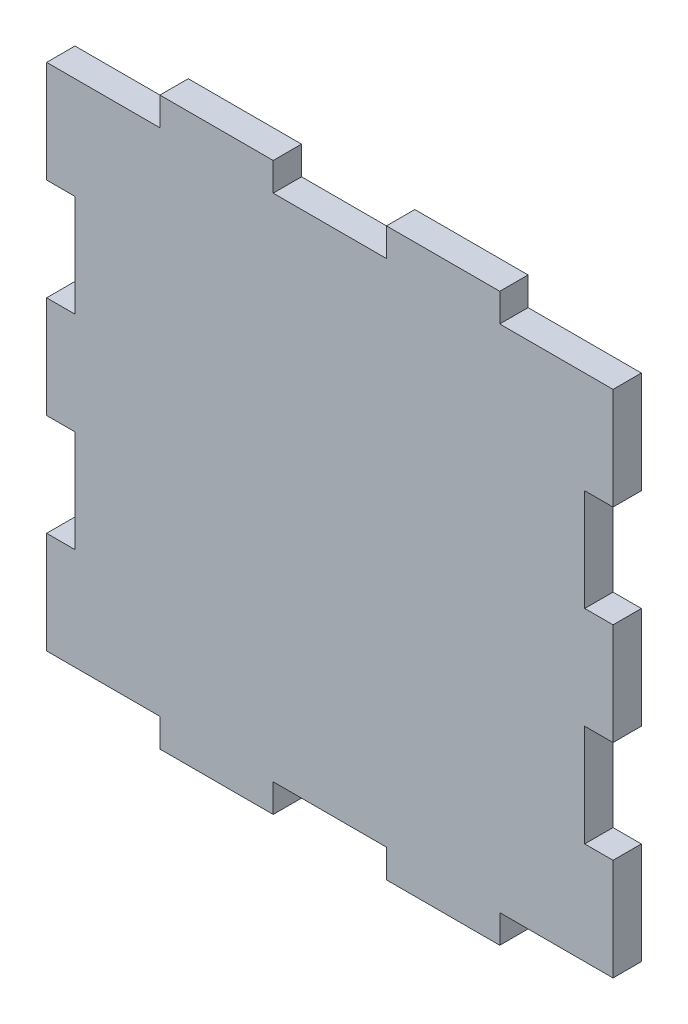
ISO-10303-21;
HEADER;
FILE_DESCRIPTION(('STEP AP214'),'2;1');
FILE_NAME('part.step','',(''),(''),'','','');
FILE_SCHEMA(('AUTOMOTIVE_DESIGN { 1 0 10303 214 1 1 1 1 }'));
ENDSEC;
DATA;
#1=APPLICATION_CONTEXT('core data for automotive mechanical design processes');
#2=APPLICATION_PROTOCOL_DEFINITION('international standard','automotive_design',2000,#1);
#3=PRODUCT_CONTEXT('',#1,'mechanical');
#4=PRODUCT('Part','Part','',(#3));
#5=PRODUCT_RELATED_PRODUCT_CATEGORY('part','',(#4));
#6=PRODUCT_DEFINITION_FORMATION('','',#4);
#7=PRODUCT_DEFINITION_CONTEXT('part definition',#1,'design');
#8=PRODUCT_DEFINITION('design','',#6,#7);
#9=PRODUCT_DEFINITION_SHAPE('','',#8);
#10=(LENGTH_UNIT() NAMED_UNIT(*) SI_UNIT(.MILLI.,.METRE.));
#11=(NAMED_UNIT(*) PLANE_ANGLE_UNIT() SI_UNIT($,.RADIAN.));
#12=(NAMED_UNIT(*) SI_UNIT($,.STERADIAN.) SOLID_ANGLE_UNIT());
#13=UNCERTAINTY_MEASURE_WITH_UNIT(LENGTH_MEASURE(1.E-05),#10,'distance_accuracy_value','');
#14=(GEOMETRIC_REPRESENTATION_CONTEXT(3) GLOBAL_UNCERTAINTY_ASSIGNED_CONTEXT((#13)) GLOBAL_UNIT_ASSIGNED_CONTEXT((#10,
#11,#12)) REPRESENTATION_CONTEXT('',''));
#15=CARTESIAN_POINT('',(0.,0.,0.));
#16=DIRECTION('',(0.,0.,1.));
#17=DIRECTION('',(1.,0.,0.));
#18=AXIS2_PLACEMENT_3D('',#15,#16,#17);
#19=CARTESIAN_POINT('',(0.,-90.,5.));
#20=DIRECTION('',(0.,1.,0.));
#21=DIRECTION('',(0.,0.,1.));
#22=AXIS2_PLACEMENT_3D('',#19,#20,#21);
#23=PLANE('',#22);
#24=DIRECTION('',(1.,0.,0.));
#25=VECTOR('',#24,1.);
#26=CARTESIAN_POINT('',(0.,-90.,5.));
#27=LINE('',#26,#25);
#28=CARTESIAN_POINT('',(-20.,-90.,5.));
#29=VERTEX_POINT('',#28);
#30=CARTESIAN_POINT('',(0.,-90.,5.));
#31=VERTEX_POINT('',#30);
#32=EDGE_CURVE('E51',#29,#31,#27,.T.);
#33=ORIENTED_EDGE('',*,*,#32,.F.);
#34=DIRECTION('',(0.,0.,1.));
#35=VECTOR('',#34,1.);
#36=CARTESIAN_POINT('',(-20.,-90.,0.));
#37=LINE('',#36,#35);
#38=CARTESIAN_POINT('',(-20.,-90.,0.));
#39=VERTEX_POINT('',#38);
#40=EDGE_CURVE('E303',#39,#29,#37,.T.);
#41=ORIENTED_EDGE('',*,*,#40,.F.);
#42=DIRECTION('',(1.,0.,0.));
#43=VECTOR('',#42,1.);
#44=CARTESIAN_POINT('',(0.,-90.,0.));
#45=LINE('',#44,#43);
#46=CARTESIAN_POINT('',(0.,-90.,0.));
#47=VERTEX_POINT('',#46);
#48=EDGE_CURVE('E520',#39,#47,#45,.T.);
#49=ORIENTED_EDGE('',*,*,#48,.T.);
#50=DIRECTION('',(0.,0.,-1.));
#51=VECTOR('',#50,1.);
#52=CARTESIAN_POINT('',(0.,-90.,5.));
#53=LINE('',#52,#51);
#54=EDGE_CURVE('E505',#31,#47,#53,.T.);
#55=ORIENTED_EDGE('',*,*,#54,.F.);
#56=EDGE_LOOP('',(#33,#41,#49,#55));
#57=FACE_BOUND('',#56,.T.);
#58=ADVANCED_FACE('F36',(#57),#23,.F.);
#59=CARTESIAN_POINT('',(-60.,-90.,0.));
#60=VERTEX_POINT('',#59);
#61=CARTESIAN_POINT('',(-40.,-90.,0.));
#62=VERTEX_POINT('',#61);
#63=EDGE_CURVE('E525',#60,#62,#45,.T.);
#64=ORIENTED_EDGE('',*,*,#63,.T.);
#65=DIRECTION('',(0.,0.,1.));
#66=VECTOR('',#65,1.);
#67=CARTESIAN_POINT('',(-40.,-90.,0.));
#68=LINE('',#67,#66);
#69=CARTESIAN_POINT('',(-40.,-90.,5.));
#70=VERTEX_POINT('',#69);
#71=EDGE_CURVE('E59',#62,#70,#68,.T.);
#72=ORIENTED_EDGE('',*,*,#71,.T.);
#73=CARTESIAN_POINT('',(-60.,-90.,5.));
#74=VERTEX_POINT('',#73);
#75=EDGE_CURVE('E506',#74,#70,#27,.T.);
#76=ORIENTED_EDGE('',*,*,#75,.F.);
#77=DIRECTION('',(0.,0.,1.));
#78=VECTOR('',#77,1.);
#79=CARTESIAN_POINT('',(-60.,-90.,0.));
#80=LINE('',#79,#78);
#81=EDGE_CURVE('E325',#60,#74,#80,.T.);
#82=ORIENTED_EDGE('',*,*,#81,.F.);
#83=EDGE_LOOP('',(#64,#72,#76,#82));
#84=FACE_BOUND('',#83,.T.);
#85=ADVANCED_FACE('F581',(#84),#23,.F.);
#86=CARTESIAN_POINT('',(0.,0.,5.));
#87=DIRECTION('',(0.,-1.,0.));
#88=DIRECTION('',(0.,0.,-1.));
#89=AXIS2_PLACEMENT_3D('',#86,#87,#88);
#90=PLANE('',#89);
#91=DIRECTION('',(0.,0.,1.));
#92=VECTOR('',#91,1.);
#93=CARTESIAN_POINT('',(-20.,0.,0.));
#94=LINE('',#93,#92);
#95=CARTESIAN_POINT('',(-20.,0.,0.));
#96=VERTEX_POINT('',#95);
#97=CARTESIAN_POINT('',(-20.,0.,5.));
#98=VERTEX_POINT('',#97);
#99=EDGE_CURVE('E346',#96,#98,#94,.T.);
#100=ORIENTED_EDGE('',*,*,#99,.T.);
#101=DIRECTION('',(-1.,0.,0.));
#102=VECTOR('',#101,1.);
#103=CARTESIAN_POINT('',(0.,0.,5.));
#104=LINE('',#103,#102);
#105=CARTESIAN_POINT('',(0.,0.,5.));
#106=VERTEX_POINT('',#105);
#107=EDGE_CURVE('E493',#106,#98,#104,.T.);
#108=ORIENTED_EDGE('',*,*,#107,.F.);
#109=DIRECTION('',(0.,0.,-1.));
#110=VECTOR('',#109,1.);
#111=CARTESIAN_POINT('',(0.,0.,5.));
#112=LINE('',#111,#110);
#113=CARTESIAN_POINT('',(0.,0.,0.));
#114=VERTEX_POINT('',#113);
#115=EDGE_CURVE('E12',#106,#114,#112,.T.);
#116=ORIENTED_EDGE('',*,*,#115,.T.);
#117=DIRECTION('',(-1.,0.,0.));
#118=VECTOR('',#117,1.);
#119=CARTESIAN_POINT('',(0.,0.,0.));
#120=LINE('',#119,#118);
#121=EDGE_CURVE('E512',#114,#96,#120,.T.);
#122=ORIENTED_EDGE('',*,*,#121,.T.);
#123=EDGE_LOOP('',(#100,#108,#116,#122));
#124=FACE_BOUND('',#123,.T.);
#125=ADVANCED_FACE('F570',(#124),#90,.F.);
#126=DIRECTION('',(0.,0.,1.));
#127=VECTOR('',#126,1.);
#128=CARTESIAN_POINT('',(-40.,0.,0.));
#129=LINE('',#128,#127);
#130=CARTESIAN_POINT('',(-40.,0.,0.));
#131=VERTEX_POINT('',#130);
#132=CARTESIAN_POINT('',(-40.,0.,5.));
#133=VERTEX_POINT('',#132);
#134=EDGE_CURVE('E350',#131,#133,#129,.T.);
#135=ORIENTED_EDGE('',*,*,#134,.F.);
#136=CARTESIAN_POINT('',(-60.,0.,0.));
#137=VERTEX_POINT('',#136);
#138=EDGE_CURVE('E516',#131,#137,#120,.T.);
#139=ORIENTED_EDGE('',*,*,#138,.T.);
#140=DIRECTION('',(0.,0.,1.));
#141=VECTOR('',#140,1.);
#142=CARTESIAN_POINT('',(-60.,0.,0.));
#143=LINE('',#142,#141);
#144=CARTESIAN_POINT('',(-60.,0.,5.));
#145=VERTEX_POINT('',#144);
#146=EDGE_CURVE('E372',#137,#145,#143,.T.);
#147=ORIENTED_EDGE('',*,*,#146,.T.);
#148=EDGE_CURVE('E497',#133,#145,#104,.T.);
#149=ORIENTED_EDGE('',*,*,#148,.F.);
#150=EDGE_LOOP('',(#135,#139,#147,#149));
#151=FACE_BOUND('',#150,.T.);
#152=ADVANCED_FACE('F560',(#151),#90,.F.);
#153=DIRECTION('',(0.,0.,1.));
#154=VECTOR('',#153,1.);
#155=CARTESIAN_POINT('',(-80.,0.,0.));
#156=LINE('',#155,#154);
#157=CARTESIAN_POINT('',(-80.,0.,0.));
#158=VERTEX_POINT('',#157);
#159=CARTESIAN_POINT('',(-80.,0.,5.));
#160=VERTEX_POINT('',#159);
#161=EDGE_CURVE('E376',#158,#160,#156,.T.);
#162=ORIENTED_EDGE('',*,*,#161,.F.);
#163=CARTESIAN_POINT('',(-100.,0.,0.));
#164=VERTEX_POINT('',#163);
#165=EDGE_CURVE('E510',#158,#164,#120,.T.);
#166=ORIENTED_EDGE('',*,*,#165,.T.);
#167=DIRECTION('',(0.,0.,-1.));
#168=VECTOR('',#167,1.);
#169=CARTESIAN_POINT('',(-100.,0.,5.));
#170=LINE('',#169,#168);
#171=CARTESIAN_POINT('',(-100.,0.,5.));
#172=VERTEX_POINT('',#171);
#173=EDGE_CURVE('E44',#172,#164,#170,.T.);
#174=ORIENTED_EDGE('',*,*,#173,.F.);
#175=EDGE_CURVE('E490',#160,#172,#104,.T.);
#176=ORIENTED_EDGE('',*,*,#175,.F.);
#177=EDGE_LOOP('',(#162,#166,#174,#176));
#178=FACE_BOUND('',#177,.T.);
#179=ADVANCED_FACE('F568',(#178),#90,.F.);
#180=CARTESIAN_POINT('',(0.,0.,5.));
#181=DIRECTION('',(-1.,0.,0.));
#182=DIRECTION('',(0.,0.,1.));
#183=AXIS2_PLACEMENT_3D('',#180,#181,#182);
#184=PLANE('',#183);
#185=DIRECTION('',(0.,0.,1.));
#186=VECTOR('',#185,1.);
#187=CARTESIAN_POINT('',(0.,-18.,0.));
#188=LINE('',#187,#186);
#189=CARTESIAN_POINT('',(0.,-18.,0.));
#190=VERTEX_POINT('',#189);
#191=CARTESIAN_POINT('',(0.,-18.,5.));
#192=VERTEX_POINT('',#191);
#193=EDGE_CURVE('E451',#190,#192,#188,.T.);
#194=ORIENTED_EDGE('',*,*,#193,.F.);
#195=DIRECTION('',(0.,1.,0.));
#196=VECTOR('',#195,1.);
#197=CARTESIAN_POINT('',(0.,0.,0.));
#198=LINE('',#197,#196);
#199=EDGE_CURVE('E453',#190,#114,#198,.T.);
#200=ORIENTED_EDGE('',*,*,#199,.T.);
#201=ORIENTED_EDGE('',*,*,#115,.F.);
#202=DIRECTION('',(0.,1.,0.));
#203=VECTOR('',#202,1.);
#204=CARTESIAN_POINT('',(0.,0.,5.));
#205=LINE('',#204,#203);
#206=EDGE_CURVE('E492',#192,#106,#205,.T.);
#207=ORIENTED_EDGE('',*,*,#206,.F.);
#208=EDGE_LOOP('',(#194,#200,#201,#207));
#209=FACE_BOUND('',#208,.T.);
#210=ADVANCED_FACE('F38',(#209),#184,.F.);
#211=DIRECTION('',(0.,0.,1.));
#212=VECTOR('',#211,1.);
#213=CARTESIAN_POINT('',(0.,-36.,0.));
#214=LINE('',#213,#212);
#215=CARTESIAN_POINT('',(0.,-36.,0.));
#216=VERTEX_POINT('',#215);
#217=CARTESIAN_POINT('',(0.,-36.,5.));
#218=VERTEX_POINT('',#217);
#219=EDGE_CURVE('E458',#216,#218,#214,.T.);
#220=ORIENTED_EDGE('',*,*,#219,.T.);
#221=CARTESIAN_POINT('',(0.,-54.,5.));
#222=VERTEX_POINT('',#221);
#223=EDGE_CURVE('E491',#222,#218,#205,.T.);
#224=ORIENTED_EDGE('',*,*,#223,.F.);
#225=DIRECTION('',(0.,0.,1.));
#226=VECTOR('',#225,1.);
#227=CARTESIAN_POINT('',(0.,-54.,0.));
#228=LINE('',#227,#226);
#229=CARTESIAN_POINT('',(0.,-54.,0.));
#230=VERTEX_POINT('',#229);
#231=EDGE_CURVE('E461',#230,#222,#228,.T.);
#232=ORIENTED_EDGE('',*,*,#231,.F.);
#233=EDGE_CURVE('E511',#230,#216,#198,.T.);
#234=ORIENTED_EDGE('',*,*,#233,.T.);
#235=EDGE_LOOP('',(#220,#224,#232,#234));
#236=FACE_BOUND('',#235,.T.);
#237=ADVANCED_FACE('F576',(#236),#184,.F.);
#238=DIRECTION('',(0.,0.,1.));
#239=VECTOR('',#238,1.);
#240=CARTESIAN_POINT('',(0.,-72.,0.));
#241=LINE('',#240,#239);
#242=CARTESIAN_POINT('',(0.,-72.,0.));
#243=VERTEX_POINT('',#242);
#244=CARTESIAN_POINT('',(0.,-72.,5.));
#245=VERTEX_POINT('',#244);
#246=EDGE_CURVE('E467',#243,#245,#241,.T.);
#247=ORIENTED_EDGE('',*,*,#246,.T.);
#248=EDGE_CURVE('E487',#31,#245,#205,.T.);
#249=ORIENTED_EDGE('',*,*,#248,.F.);
#250=ORIENTED_EDGE('',*,*,#54,.T.);
#251=EDGE_CURVE('E507',#47,#243,#198,.T.);
#252=ORIENTED_EDGE('',*,*,#251,.T.);
#253=EDGE_LOOP('',(#247,#249,#250,#252));
#254=FACE_BOUND('',#253,.T.);
#255=ADVANCED_FACE('F578',(#254),#184,.F.);
#256=CARTESIAN_POINT('',(-100.,0.,5.));
#257=DIRECTION('',(1.,0.,0.));
#258=DIRECTION('',(0.,0.,-1.));
#259=AXIS2_PLACEMENT_3D('',#256,#257,#258);
#260=PLANE('',#259);
#261=DIRECTION('',(0.,0.,1.));
#262=VECTOR('',#261,1.);
#263=CARTESIAN_POINT('',(-100.,-72.,0.));
#264=LINE('',#263,#262);
#265=CARTESIAN_POINT('',(-100.,-72.,0.));
#266=VERTEX_POINT('',#265);
#267=CARTESIAN_POINT('',(-100.,-72.,5.));
#268=VERTEX_POINT('',#267);
#269=EDGE_CURVE('E470',#266,#268,#264,.T.);
#270=ORIENTED_EDGE('',*,*,#269,.F.);
#271=DIRECTION('',(0.,-1.,0.));
#272=VECTOR('',#271,1.);
#273=CARTESIAN_POINT('',(-100.,0.,0.));
#274=LINE('',#273,#272);
#275=CARTESIAN_POINT('',(-100.,-90.,0.));
#276=VERTEX_POINT('',#275);
#277=EDGE_CURVE('E515',#266,#276,#274,.T.);
#278=ORIENTED_EDGE('',*,*,#277,.T.);
#279=DIRECTION('',(0.,0.,-1.));
#280=VECTOR('',#279,1.);
#281=CARTESIAN_POINT('',(-100.,-90.,5.));
#282=LINE('',#281,#280);
#283=CARTESIAN_POINT('',(-100.,-90.,5.));
#284=VERTEX_POINT('',#283);
#285=EDGE_CURVE('E528',#284,#276,#282,.T.);
#286=ORIENTED_EDGE('',*,*,#285,.F.);
#287=DIRECTION('',(0.,-1.,0.));
#288=VECTOR('',#287,1.);
#289=CARTESIAN_POINT('',(-100.,0.,5.));
#290=LINE('',#289,#288);
#291=EDGE_CURVE('E496',#268,#284,#290,.T.);
#292=ORIENTED_EDGE('',*,*,#291,.F.);
#293=EDGE_LOOP('',(#270,#278,#286,#292));
#294=FACE_BOUND('',#293,.T.);
#295=ADVANCED_FACE('F617',(#294),#260,.F.);
#296=DIRECTION('',(0.,0.,1.));
#297=VECTOR('',#296,1.);
#298=CARTESIAN_POINT('',(-100.,-54.,0.));
#299=LINE('',#298,#297);
#300=CARTESIAN_POINT('',(-100.,-54.,0.));
#301=VERTEX_POINT('',#300);
#302=CARTESIAN_POINT('',(-100.,-54.,5.));
#303=VERTEX_POINT('',#302);
#304=EDGE_CURVE('E476',#301,#303,#299,.T.);
#305=ORIENTED_EDGE('',*,*,#304,.T.);
#306=CARTESIAN_POINT('',(-100.,-36.,5.));
#307=VERTEX_POINT('',#306);
#308=EDGE_CURVE('E501',#307,#303,#290,.T.);
#309=ORIENTED_EDGE('',*,*,#308,.F.);
#310=DIRECTION('',(0.,0.,1.));
#311=VECTOR('',#310,1.);
#312=CARTESIAN_POINT('',(-100.,-36.,0.));
#313=LINE('',#312,#311);
#314=CARTESIAN_POINT('',(-100.,-36.,0.));
#315=VERTEX_POINT('',#314);
#316=EDGE_CURVE('E479',#315,#307,#313,.T.);
#317=ORIENTED_EDGE('',*,*,#316,.F.);
#318=EDGE_CURVE('E521',#315,#301,#274,.T.);
#319=ORIENTED_EDGE('',*,*,#318,.T.);
#320=EDGE_LOOP('',(#305,#309,#317,#319));
#321=FACE_BOUND('',#320,.T.);
#322=ADVANCED_FACE('F622',(#321),#260,.F.);
#323=DIRECTION('',(0.,0.,1.));
#324=VECTOR('',#323,1.);
#325=CARTESIAN_POINT('',(-100.,-18.,0.));
#326=LINE('',#325,#324);
#327=CARTESIAN_POINT('',(-100.,-18.,0.));
#328=VERTEX_POINT('',#327);
#329=CARTESIAN_POINT('',(-100.,-18.,5.));
#330=VERTEX_POINT('',#329);
#331=EDGE_CURVE('E416',#328,#330,#326,.T.);
#332=ORIENTED_EDGE('',*,*,#331,.T.);
#333=EDGE_CURVE('E498',#172,#330,#290,.T.);
#334=ORIENTED_EDGE('',*,*,#333,.F.);
#335=ORIENTED_EDGE('',*,*,#173,.T.);
#336=EDGE_CURVE('E517',#164,#328,#274,.T.);
#337=ORIENTED_EDGE('',*,*,#336,.T.);
#338=EDGE_LOOP('',(#332,#334,#335,#337));
#339=FACE_BOUND('',#338,.T.);
#340=ADVANCED_FACE('F535',(#339),#260,.F.);
#341=CARTESIAN_POINT('',(0.,0.,5.));
#342=DIRECTION('',(0.,0.,-1.));
#343=DIRECTION('',(-1.,0.,0.));
#344=AXIS2_PLACEMENT_3D('',#341,#342,#343);
#345=PLANE('',#344);
#346=DIRECTION('',(1.,0.,0.));
#347=VECTOR('',#346,1.);
#348=CARTESIAN_POINT('',(0.,-18.,5.));
#349=LINE('',#348,#347);
#350=CARTESIAN_POINT('',(-5.,-18.,5.));
#351=VERTEX_POINT('',#350);
#352=EDGE_CURVE('E387',#351,#192,#349,.T.);
#353=ORIENTED_EDGE('',*,*,#352,.T.);
#354=ORIENTED_EDGE('',*,*,#206,.T.);
#355=ORIENTED_EDGE('',*,*,#107,.T.);
#356=DIRECTION('',(0.,-1.,0.));
#357=VECTOR('',#356,1.);
#358=CARTESIAN_POINT('',(-20.,0.,5.));
#359=LINE('',#358,#357);
#360=CARTESIAN_POINT('',(-20.,5.00000000000001,5.));
#361=VERTEX_POINT('',#360);
#362=EDGE_CURVE('E327',#361,#98,#359,.T.);
#363=ORIENTED_EDGE('',*,*,#362,.F.);
#364=DIRECTION('',(1.,0.,0.));
#365=VECTOR('',#364,1.);
#366=CARTESIAN_POINT('',(0.,5.00000000000001,5.));
#367=LINE('',#366,#365);
#368=CARTESIAN_POINT('',(-40.,5.00000000000001,5.));
#369=VERTEX_POINT('',#368);
#370=EDGE_CURVE('E343',#369,#361,#367,.T.);
#371=ORIENTED_EDGE('',*,*,#370,.F.);
#372=DIRECTION('',(0.,1.,0.));
#373=VECTOR('',#372,1.);
#374=CARTESIAN_POINT('',(-40.,0.,5.));
#375=LINE('',#374,#373);
#376=EDGE_CURVE('E337',#133,#369,#375,.T.);
#377=ORIENTED_EDGE('',*,*,#376,.F.);
#378=ORIENTED_EDGE('',*,*,#148,.T.);
#379=DIRECTION('',(0.,-1.,0.));
#380=VECTOR('',#379,1.);
#381=CARTESIAN_POINT('',(-60.,0.,5.));
#382=LINE('',#381,#380);
#383=CARTESIAN_POINT('',(-60.,5.00000000000001,5.));
#384=VERTEX_POINT('',#383);
#385=EDGE_CURVE('E349',#384,#145,#382,.T.);
#386=ORIENTED_EDGE('',*,*,#385,.F.);
#387=DIRECTION('',(1.,0.,0.));
#388=VECTOR('',#387,1.);
#389=CARTESIAN_POINT('',(0.,5.00000000000001,5.));
#390=LINE('',#389,#388);
#391=CARTESIAN_POINT('',(-80.,5.,5.));
#392=VERTEX_POINT('',#391);
#393=EDGE_CURVE('E369',#392,#384,#390,.T.);
#394=ORIENTED_EDGE('',*,*,#393,.F.);
#395=DIRECTION('',(0.,1.,0.));
#396=VECTOR('',#395,1.);
#397=CARTESIAN_POINT('',(-80.,0.,5.));
#398=LINE('',#397,#396);
#399=EDGE_CURVE('E362',#160,#392,#398,.T.);
#400=ORIENTED_EDGE('',*,*,#399,.F.);
#401=ORIENTED_EDGE('',*,*,#175,.T.);
#402=ORIENTED_EDGE('',*,*,#333,.T.);
#403=DIRECTION('',(1.,0.,0.));
#404=VECTOR('',#403,1.);
#405=CARTESIAN_POINT('',(-100.,-18.,5.));
#406=LINE('',#405,#404);
#407=CARTESIAN_POINT('',(-95.,-18.,5.));
#408=VERTEX_POINT('',#407);
#409=EDGE_CURVE('E375',#330,#408,#406,.T.);
#410=ORIENTED_EDGE('',*,*,#409,.T.);
#411=DIRECTION('',(0.,-1.,0.));
#412=VECTOR('',#411,1.);
#413=CARTESIAN_POINT('',(-95.,-18.,5.));
#414=LINE('',#413,#412);
#415=CARTESIAN_POINT('',(-95.,-36.,5.));
#416=VERTEX_POINT('',#415);
#417=EDGE_CURVE('E419',#408,#416,#414,.T.);
#418=ORIENTED_EDGE('',*,*,#417,.T.);
#419=DIRECTION('',(-1.,0.,0.));
#420=VECTOR('',#419,1.);
#421=CARTESIAN_POINT('',(-95.,-36.,5.));
#422=LINE('',#421,#420);
#423=EDGE_CURVE('E422',#416,#307,#422,.T.);
#424=ORIENTED_EDGE('',*,*,#423,.T.);
#425=ORIENTED_EDGE('',*,*,#308,.T.);
#426=DIRECTION('',(1.,0.,0.));
#427=VECTOR('',#426,1.);
#428=CARTESIAN_POINT('',(-100.,-54.,5.));
#429=LINE('',#428,#427);
#430=CARTESIAN_POINT('',(-95.,-54.,5.));
#431=VERTEX_POINT('',#430);
#432=EDGE_CURVE('E425',#303,#431,#429,.T.);
#433=ORIENTED_EDGE('',*,*,#432,.T.);
#434=DIRECTION('',(0.,-1.,0.));
#435=VECTOR('',#434,1.);
#436=CARTESIAN_POINT('',(-95.,-54.,5.));
#437=LINE('',#436,#435);
#438=CARTESIAN_POINT('',(-95.,-72.,5.));
#439=VERTEX_POINT('',#438);
#440=EDGE_CURVE('E428',#431,#439,#437,.T.);
#441=ORIENTED_EDGE('',*,*,#440,.T.);
#442=DIRECTION('',(-1.,0.,0.));
#443=VECTOR('',#442,1.);
#444=CARTESIAN_POINT('',(-95.,-72.,5.));
#445=LINE('',#444,#443);
#446=EDGE_CURVE('E431',#439,#268,#445,.T.);
#447=ORIENTED_EDGE('',*,*,#446,.T.);
#448=ORIENTED_EDGE('',*,*,#291,.T.);
#449=CARTESIAN_POINT('',(-80.,-90.,5.));
#450=VERTEX_POINT('',#449);
#451=EDGE_CURVE('E502',#284,#450,#27,.T.);
#452=ORIENTED_EDGE('',*,*,#451,.T.);
#453=DIRECTION('',(0.,-1.,0.));
#454=VECTOR('',#453,1.);
#455=CARTESIAN_POINT('',(-80.,0.,5.));
#456=LINE('',#455,#454);
#457=CARTESIAN_POINT('',(-80.,-95.,5.));
#458=VERTEX_POINT('',#457);
#459=EDGE_CURVE('E305',#450,#458,#456,.T.);
#460=ORIENTED_EDGE('',*,*,#459,.T.);
#461=DIRECTION('',(1.,0.,0.));
#462=VECTOR('',#461,1.);
#463=CARTESIAN_POINT('',(0.,-95.,5.));
#464=LINE('',#463,#462);
#465=CARTESIAN_POINT('',(-60.,-95.,5.));
#466=VERTEX_POINT('',#465);
#467=EDGE_CURVE('E320',#458,#466,#464,.T.);
#468=ORIENTED_EDGE('',*,*,#467,.T.);
#469=DIRECTION('',(0.,1.,0.));
#470=VECTOR('',#469,1.);
#471=CARTESIAN_POINT('',(-60.,0.,5.));
#472=LINE('',#471,#470);
#473=EDGE_CURVE('E312',#466,#74,#472,.T.);
#474=ORIENTED_EDGE('',*,*,#473,.T.);
#475=ORIENTED_EDGE('',*,*,#75,.T.);
#476=DIRECTION('',(0.,-1.,0.));
#477=VECTOR('',#476,1.);
#478=CARTESIAN_POINT('',(-40.,0.,5.));
#479=LINE('',#478,#477);
#480=CARTESIAN_POINT('',(-40.,-95.,5.));
#481=VERTEX_POINT('',#480);
#482=EDGE_CURVE('E300',#70,#481,#479,.T.);
#483=ORIENTED_EDGE('',*,*,#482,.T.);
#484=DIRECTION('',(1.,0.,0.));
#485=VECTOR('',#484,1.);
#486=CARTESIAN_POINT('',(0.,-95.,5.));
#487=LINE('',#486,#485);
#488=CARTESIAN_POINT('',(-20.,-95.,5.));
#489=VERTEX_POINT('',#488);
#490=EDGE_CURVE('E277',#481,#489,#487,.T.);
#491=ORIENTED_EDGE('',*,*,#490,.T.);
#492=DIRECTION('',(0.,1.,0.));
#493=VECTOR('',#492,1.);
#494=CARTESIAN_POINT('',(-20.,0.,5.));
#495=LINE('',#494,#493);
#496=EDGE_CURVE('E294',#489,#29,#495,.T.);
#497=ORIENTED_EDGE('',*,*,#496,.T.);
#498=ORIENTED_EDGE('',*,*,#32,.T.);
#499=ORIENTED_EDGE('',*,*,#248,.T.);
#500=DIRECTION('',(-1.,0.,0.));
#501=VECTOR('',#500,1.);
#502=CARTESIAN_POINT('',(-5.,-72.,5.));
#503=LINE('',#502,#501);
#504=CARTESIAN_POINT('',(-5.,-72.,5.));
#505=VERTEX_POINT('',#504);
#506=EDGE_CURVE('E434',#245,#505,#503,.T.);
#507=ORIENTED_EDGE('',*,*,#506,.T.);
#508=DIRECTION('',(0.,1.,0.));
#509=VECTOR('',#508,1.);
#510=CARTESIAN_POINT('',(-5.,-54.,5.));
#511=LINE('',#510,#509);
#512=CARTESIAN_POINT('',(-5.,-54.,5.));
#513=VERTEX_POINT('',#512);
#514=EDGE_CURVE('E437',#505,#513,#511,.T.);
#515=ORIENTED_EDGE('',*,*,#514,.T.);
#516=DIRECTION('',(1.,0.,0.));
#517=VECTOR('',#516,1.);
#518=CARTESIAN_POINT('',(0.,-54.,5.));
#519=LINE('',#518,#517);
#520=EDGE_CURVE('E440',#513,#222,#519,.T.);
#521=ORIENTED_EDGE('',*,*,#520,.T.);
#522=ORIENTED_EDGE('',*,*,#223,.T.);
#523=DIRECTION('',(-1.,0.,0.));
#524=VECTOR('',#523,1.);
#525=CARTESIAN_POINT('',(-5.,-36.,5.));
#526=LINE('',#525,#524);
#527=CARTESIAN_POINT('',(-5.,-36.,5.));
#528=VERTEX_POINT('',#527);
#529=EDGE_CURVE('E443',#218,#528,#526,.T.);
#530=ORIENTED_EDGE('',*,*,#529,.T.);
#531=DIRECTION('',(0.,1.,0.));
#532=VECTOR('',#531,1.);
#533=CARTESIAN_POINT('',(-5.,-18.,5.));
#534=LINE('',#533,#532);
#535=EDGE_CURVE('E446',#528,#351,#534,.T.);
#536=ORIENTED_EDGE('',*,*,#535,.T.);
#537=EDGE_LOOP('',(#353,#354,#355,#363,#371,#377,#378,#386,#394,#400,#401,#402,#410,#418,#424,
#425,#433,#441,#447,#448,#452,#460,#468,#474,#475,#483,#491,#497,#498,#499,#507,#515,#521,#522,
#530,#536));
#538=FACE_BOUND('',#537,.T.);
#539=ADVANCED_FACE('F546',(#538),#345,.F.);
#540=CARTESIAN_POINT('',(0.,0.,0.));
#541=DIRECTION('',(0.,0.,-1.));
#542=DIRECTION('',(-1.,0.,0.));
#543=AXIS2_PLACEMENT_3D('',#540,#541,#542);
#544=PLANE('',#543);
#545=ORIENTED_EDGE('',*,*,#199,.F.);
#546=DIRECTION('',(1.,0.,0.));
#547=VECTOR('',#546,1.);
#548=CARTESIAN_POINT('',(0.,-18.,0.));
#549=LINE('',#548,#547);
#550=CARTESIAN_POINT('',(-5.,-18.,0.));
#551=VERTEX_POINT('',#550);
#552=EDGE_CURVE('E414',#551,#190,#549,.T.);
#553=ORIENTED_EDGE('',*,*,#552,.F.);
#554=DIRECTION('',(0.,1.,0.));
#555=VECTOR('',#554,1.);
#556=CARTESIAN_POINT('',(-5.,-18.,0.));
#557=LINE('',#556,#555);
#558=CARTESIAN_POINT('',(-5.,-36.,0.));
#559=VERTEX_POINT('',#558);
#560=EDGE_CURVE('E411',#559,#551,#557,.T.);
#561=ORIENTED_EDGE('',*,*,#560,.F.);
#562=DIRECTION('',(-1.,0.,0.));
#563=VECTOR('',#562,1.);
#564=CARTESIAN_POINT('',(-5.,-36.,0.));
#565=LINE('',#564,#563);
#566=EDGE_CURVE('E408',#216,#559,#565,.T.);
#567=ORIENTED_EDGE('',*,*,#566,.F.);
#568=ORIENTED_EDGE('',*,*,#233,.F.);
#569=DIRECTION('',(1.,0.,0.));
#570=VECTOR('',#569,1.);
#571=CARTESIAN_POINT('',(0.,-54.,0.));
#572=LINE('',#571,#570);
#573=CARTESIAN_POINT('',(-5.,-54.,0.));
#574=VERTEX_POINT('',#573);
#575=EDGE_CURVE('E406',#574,#230,#572,.T.);
#576=ORIENTED_EDGE('',*,*,#575,.F.);
#577=DIRECTION('',(0.,1.,0.));
#578=VECTOR('',#577,1.);
#579=CARTESIAN_POINT('',(-5.,-54.,0.));
#580=LINE('',#579,#578);
#581=CARTESIAN_POINT('',(-5.,-72.,0.));
#582=VERTEX_POINT('',#581);
#583=EDGE_CURVE('E403',#582,#574,#580,.T.);
#584=ORIENTED_EDGE('',*,*,#583,.F.);
#585=DIRECTION('',(-1.,0.,0.));
#586=VECTOR('',#585,1.);
#587=CARTESIAN_POINT('',(-5.,-72.,0.));
#588=LINE('',#587,#586);
#589=EDGE_CURVE('E400',#243,#582,#588,.T.);
#590=ORIENTED_EDGE('',*,*,#589,.F.);
#591=ORIENTED_EDGE('',*,*,#251,.F.);
#592=ORIENTED_EDGE('',*,*,#48,.F.);
#593=DIRECTION('',(0.,1.,0.));
#594=VECTOR('',#593,1.);
#595=CARTESIAN_POINT('',(-20.,0.,0.));
#596=LINE('',#595,#594);
#597=CARTESIAN_POINT('',(-20.,-95.,0.));
#598=VERTEX_POINT('',#597);
#599=EDGE_CURVE('E291',#598,#39,#596,.T.);
#600=ORIENTED_EDGE('',*,*,#599,.F.);
#601=DIRECTION('',(1.,0.,0.));
#602=VECTOR('',#601,1.);
#603=CARTESIAN_POINT('',(0.,-95.,0.));
#604=LINE('',#603,#602);
#605=CARTESIAN_POINT('',(-40.,-95.,0.));
#606=VERTEX_POINT('',#605);
#607=EDGE_CURVE('E274',#606,#598,#604,.T.);
#608=ORIENTED_EDGE('',*,*,#607,.F.);
#609=DIRECTION('',(0.,-1.,0.));
#610=VECTOR('',#609,1.);
#611=CARTESIAN_POINT('',(-40.,0.,0.));
#612=LINE('',#611,#610);
#613=EDGE_CURVE('E289',#62,#606,#612,.T.);
#614=ORIENTED_EDGE('',*,*,#613,.F.);
#615=ORIENTED_EDGE('',*,*,#63,.F.);
#616=DIRECTION('',(0.,1.,0.));
#617=VECTOR('',#616,1.);
#618=CARTESIAN_POINT('',(-60.,0.,0.));
#619=LINE('',#618,#617);
#620=CARTESIAN_POINT('',(-60.,-95.,0.));
#621=VERTEX_POINT('',#620);
#622=EDGE_CURVE('E315',#621,#60,#619,.T.);
#623=ORIENTED_EDGE('',*,*,#622,.F.);
#624=DIRECTION('',(1.,0.,0.));
#625=VECTOR('',#624,1.);
#626=CARTESIAN_POINT('',(0.,-95.,0.));
#627=LINE('',#626,#625);
#628=CARTESIAN_POINT('',(-80.,-95.,0.));
#629=VERTEX_POINT('',#628);
#630=EDGE_CURVE('E311',#629,#621,#627,.T.);
#631=ORIENTED_EDGE('',*,*,#630,.F.);
#632=DIRECTION('',(0.,-1.,0.));
#633=VECTOR('',#632,1.);
#634=CARTESIAN_POINT('',(-80.,0.,0.));
#635=LINE('',#634,#633);
#636=CARTESIAN_POINT('',(-80.,-90.,0.));
#637=VERTEX_POINT('',#636);
#638=EDGE_CURVE('E308',#637,#629,#635,.T.);
#639=ORIENTED_EDGE('',*,*,#638,.F.);
#640=EDGE_CURVE('E522',#276,#637,#45,.T.);
#641=ORIENTED_EDGE('',*,*,#640,.F.);
#642=ORIENTED_EDGE('',*,*,#277,.F.);
#643=DIRECTION('',(-1.,0.,0.));
#644=VECTOR('',#643,1.);
#645=CARTESIAN_POINT('',(-95.,-72.,0.));
#646=LINE('',#645,#644);
#647=CARTESIAN_POINT('',(-95.,-72.,0.));
#648=VERTEX_POINT('',#647);
#649=EDGE_CURVE('E398',#648,#266,#646,.T.);
#650=ORIENTED_EDGE('',*,*,#649,.F.);
#651=DIRECTION('',(0.,-1.,0.));
#652=VECTOR('',#651,1.);
#653=CARTESIAN_POINT('',(-95.,-54.,0.));
#654=LINE('',#653,#652);
#655=CARTESIAN_POINT('',(-95.,-54.,0.));
#656=VERTEX_POINT('',#655);
#657=EDGE_CURVE('E395',#656,#648,#654,.T.);
#658=ORIENTED_EDGE('',*,*,#657,.F.);
#659=DIRECTION('',(1.,0.,0.));
#660=VECTOR('',#659,1.);
#661=CARTESIAN_POINT('',(-100.,-54.,0.));
#662=LINE('',#661,#660);
#663=EDGE_CURVE('E392',#301,#656,#662,.T.);
#664=ORIENTED_EDGE('',*,*,#663,.F.);
#665=ORIENTED_EDGE('',*,*,#318,.F.);
#666=DIRECTION('',(-1.,0.,0.));
#667=VECTOR('',#666,1.);
#668=CARTESIAN_POINT('',(-95.,-36.,0.));
#669=LINE('',#668,#667);
#670=CARTESIAN_POINT('',(-95.,-36.,0.));
#671=VERTEX_POINT('',#670);
#672=EDGE_CURVE('E390',#671,#315,#669,.T.);
#673=ORIENTED_EDGE('',*,*,#672,.F.);
#674=DIRECTION('',(0.,-1.,0.));
#675=VECTOR('',#674,1.);
#676=CARTESIAN_POINT('',(-95.,-18.,0.));
#677=LINE('',#676,#675);
#678=CARTESIAN_POINT('',(-95.,-18.,0.));
#679=VERTEX_POINT('',#678);
#680=EDGE_CURVE('E386',#679,#671,#677,.T.);
#681=ORIENTED_EDGE('',*,*,#680,.F.);
#682=DIRECTION('',(1.,0.,0.));
#683=VECTOR('',#682,1.);
#684=CARTESIAN_POINT('',(-100.,-18.,0.));
#685=LINE('',#684,#683);
#686=EDGE_CURVE('E383',#328,#679,#685,.T.);
#687=ORIENTED_EDGE('',*,*,#686,.F.);
#688=ORIENTED_EDGE('',*,*,#336,.F.);
#689=ORIENTED_EDGE('',*,*,#165,.F.);
#690=DIRECTION('',(0.,1.,0.));
#691=VECTOR('',#690,1.);
#692=CARTESIAN_POINT('',(-80.,0.,0.));
#693=LINE('',#692,#691);
#694=CARTESIAN_POINT('',(-80.,5.,0.));
#695=VERTEX_POINT('',#694);
#696=EDGE_CURVE('E364',#158,#695,#693,.T.);
#697=ORIENTED_EDGE('',*,*,#696,.T.);
#698=DIRECTION('',(1.,0.,0.));
#699=VECTOR('',#698,1.);
#700=CARTESIAN_POINT('',(0.,5.00000000000001,0.));
#701=LINE('',#700,#699);
#702=CARTESIAN_POINT('',(-60.,5.00000000000001,0.));
#703=VERTEX_POINT('',#702);
#704=EDGE_CURVE('E361',#695,#703,#701,.T.);
#705=ORIENTED_EDGE('',*,*,#704,.T.);
#706=DIRECTION('',(0.,-1.,0.));
#707=VECTOR('',#706,1.);
#708=CARTESIAN_POINT('',(-60.,0.,0.));
#709=LINE('',#708,#707);
#710=EDGE_CURVE('E358',#703,#137,#709,.T.);
#711=ORIENTED_EDGE('',*,*,#710,.T.);
#712=ORIENTED_EDGE('',*,*,#138,.F.);
#713=DIRECTION('',(0.,1.,0.));
#714=VECTOR('',#713,1.);
#715=CARTESIAN_POINT('',(-40.,0.,0.));
#716=LINE('',#715,#714);
#717=CARTESIAN_POINT('',(-40.,5.00000000000001,0.));
#718=VERTEX_POINT('',#717);
#719=EDGE_CURVE('E339',#131,#718,#716,.T.);
#720=ORIENTED_EDGE('',*,*,#719,.T.);
#721=DIRECTION('',(1.,0.,0.));
#722=VECTOR('',#721,1.);
#723=CARTESIAN_POINT('',(0.,5.00000000000001,0.));
#724=LINE('',#723,#722);
#725=CARTESIAN_POINT('',(-20.,5.00000000000001,0.));
#726=VERTEX_POINT('',#725);
#727=EDGE_CURVE('E336',#718,#726,#724,.T.);
#728=ORIENTED_EDGE('',*,*,#727,.T.);
#729=DIRECTION('',(0.,-1.,0.));
#730=VECTOR('',#729,1.);
#731=CARTESIAN_POINT('',(-20.,0.,0.));
#732=LINE('',#731,#730);
#733=EDGE_CURVE('E334',#726,#96,#732,.T.);
#734=ORIENTED_EDGE('',*,*,#733,.T.);
#735=ORIENTED_EDGE('',*,*,#121,.F.);
#736=EDGE_LOOP('',(#545,#553,#561,#567,#568,#576,#584,#590,#591,#592,#600,#608,#614,#615,#623,
#631,#639,#641,#642,#650,#658,#664,#665,#673,#681,#687,#688,#689,#697,#705,#711,#712,#720,#728,
#734,#735));
#737=FACE_BOUND('',#736,.T.);
#738=ADVANCED_FACE('F287',(#737),#544,.T.);
#739=ORIENTED_EDGE('',*,*,#640,.T.);
#740=DIRECTION('',(0.,0.,1.));
#741=VECTOR('',#740,1.);
#742=CARTESIAN_POINT('',(-80.,-90.,0.));
#743=LINE('',#742,#741);
#744=EDGE_CURVE('E317',#637,#450,#743,.T.);
#745=ORIENTED_EDGE('',*,*,#744,.T.);
#746=ORIENTED_EDGE('',*,*,#451,.F.);
#747=ORIENTED_EDGE('',*,*,#285,.T.);
#748=EDGE_LOOP('',(#739,#745,#746,#747));
#749=FACE_BOUND('',#748,.T.);
#750=ADVANCED_FACE('F585',(#749),#23,.F.);
#751=CARTESIAN_POINT('',(-100.,-18.,0.));
#752=DIRECTION('',(0.,-1.,0.));
#753=DIRECTION('',(0.,0.,-1.));
#754=AXIS2_PLACEMENT_3D('',#751,#752,#753);
#755=PLANE('',#754);
#756=ORIENTED_EDGE('',*,*,#409,.F.);
#757=ORIENTED_EDGE('',*,*,#331,.F.);
#758=ORIENTED_EDGE('',*,*,#686,.T.);
#759=DIRECTION('',(0.,0.,1.));
#760=VECTOR('',#759,1.);
#761=CARTESIAN_POINT('',(-95.,-18.,0.));
#762=LINE('',#761,#760);
#763=EDGE_CURVE('E483',#679,#408,#762,.T.);
#764=ORIENTED_EDGE('',*,*,#763,.T.);
#765=EDGE_LOOP('',(#756,#757,#758,#764));
#766=FACE_BOUND('',#765,.T.);
#767=ADVANCED_FACE('F543',(#766),#755,.T.);
#768=CARTESIAN_POINT('',(-95.,-18.,0.));
#769=DIRECTION('',(-1.,0.,0.));
#770=DIRECTION('',(0.,0.,1.));
#771=AXIS2_PLACEMENT_3D('',#768,#769,#770);
#772=PLANE('',#771);
#773=ORIENTED_EDGE('',*,*,#417,.F.);
#774=ORIENTED_EDGE('',*,*,#763,.F.);
#775=ORIENTED_EDGE('',*,*,#680,.T.);
#776=DIRECTION('',(0.,0.,1.));
#777=VECTOR('',#776,1.);
#778=CARTESIAN_POINT('',(-95.,-36.,0.));
#779=LINE('',#778,#777);
#780=EDGE_CURVE('E481',#671,#416,#779,.T.);
#781=ORIENTED_EDGE('',*,*,#780,.T.);
#782=EDGE_LOOP('',(#773,#774,#775,#781));
#783=FACE_BOUND('',#782,.T.);
#784=ADVANCED_FACE('F598',(#783),#772,.T.);
#785=CARTESIAN_POINT('',(-95.,-36.,0.));
#786=DIRECTION('',(0.,1.,0.));
#787=DIRECTION('',(-1.,0.,0.));
#788=AXIS2_PLACEMENT_3D('',#785,#786,#787);
#789=PLANE('',#788);
#790=ORIENTED_EDGE('',*,*,#423,.F.);
#791=ORIENTED_EDGE('',*,*,#780,.F.);
#792=ORIENTED_EDGE('',*,*,#672,.T.);
#793=ORIENTED_EDGE('',*,*,#316,.T.);
#794=EDGE_LOOP('',(#790,#791,#792,#793));
#795=FACE_BOUND('',#794,.T.);
#796=ADVANCED_FACE('F632',(#795),#789,.T.);
#797=CARTESIAN_POINT('',(-100.,-54.,0.));
#798=DIRECTION('',(0.,-1.,0.));
#799=DIRECTION('',(0.,0.,-1.));
#800=AXIS2_PLACEMENT_3D('',#797,#798,#799);
#801=PLANE('',#800);
#802=ORIENTED_EDGE('',*,*,#432,.F.);
#803=ORIENTED_EDGE('',*,*,#304,.F.);
#804=ORIENTED_EDGE('',*,*,#663,.T.);
#805=DIRECTION('',(0.,0.,1.));
#806=VECTOR('',#805,1.);
#807=CARTESIAN_POINT('',(-95.,-54.,0.));
#808=LINE('',#807,#806);
#809=EDGE_CURVE('E474',#656,#431,#808,.T.);
#810=ORIENTED_EDGE('',*,*,#809,.T.);
#811=EDGE_LOOP('',(#802,#803,#804,#810));
#812=FACE_BOUND('',#811,.T.);
#813=ADVANCED_FACE('F628',(#812),#801,.T.);
#814=CARTESIAN_POINT('',(-95.,-54.,0.));
#815=DIRECTION('',(-1.,0.,0.));
#816=DIRECTION('',(0.,-1.,0.));
#817=AXIS2_PLACEMENT_3D('',#814,#815,#816);
#818=PLANE('',#817);
#819=ORIENTED_EDGE('',*,*,#440,.F.);
#820=ORIENTED_EDGE('',*,*,#809,.F.);
#821=ORIENTED_EDGE('',*,*,#657,.T.);
#822=DIRECTION('',(0.,0.,1.));
#823=VECTOR('',#822,1.);
#824=CARTESIAN_POINT('',(-95.,-72.,0.));
#825=LINE('',#824,#823);
#826=EDGE_CURVE('E472',#648,#439,#825,.T.);
#827=ORIENTED_EDGE('',*,*,#826,.T.);
#828=EDGE_LOOP('',(#819,#820,#821,#827));
#829=FACE_BOUND('',#828,.T.);
#830=ADVANCED_FACE('F736',(#829),#818,.T.);
#831=CARTESIAN_POINT('',(-95.,-72.,0.));
#832=DIRECTION('',(0.,1.,0.));
#833=DIRECTION('',(0.,0.,1.));
#834=AXIS2_PLACEMENT_3D('',#831,#832,#833);
#835=PLANE('',#834);
#836=ORIENTED_EDGE('',*,*,#446,.F.);
#837=ORIENTED_EDGE('',*,*,#826,.F.);
#838=ORIENTED_EDGE('',*,*,#649,.T.);
#839=ORIENTED_EDGE('',*,*,#269,.T.);
#840=EDGE_LOOP('',(#836,#837,#838,#839));
#841=FACE_BOUND('',#840,.T.);
#842=ADVANCED_FACE('F733',(#841),#835,.T.);
#843=CARTESIAN_POINT('',(-5.,-72.,0.));
#844=DIRECTION('',(0.,1.,0.));
#845=DIRECTION('',(-1.,0.,0.));
#846=AXIS2_PLACEMENT_3D('',#843,#844,#845);
#847=PLANE('',#846);
#848=ORIENTED_EDGE('',*,*,#506,.F.);
#849=ORIENTED_EDGE('',*,*,#246,.F.);
#850=ORIENTED_EDGE('',*,*,#589,.T.);
#851=DIRECTION('',(0.,0.,1.));
#852=VECTOR('',#851,1.);
#853=CARTESIAN_POINT('',(-5.,-72.,0.));
#854=LINE('',#853,#852);
#855=EDGE_CURVE('E465',#582,#505,#854,.T.);
#856=ORIENTED_EDGE('',*,*,#855,.T.);
#857=EDGE_LOOP('',(#848,#849,#850,#856));
#858=FACE_BOUND('',#857,.T.);
#859=ADVANCED_FACE('F666',(#858),#847,.T.);
#860=CARTESIAN_POINT('',(-5.,-54.,0.));
#861=DIRECTION('',(1.,0.,0.));
#862=DIRECTION('',(0.,0.,-1.));
#863=AXIS2_PLACEMENT_3D('',#860,#861,#862);
#864=PLANE('',#863);
#865=ORIENTED_EDGE('',*,*,#514,.F.);
#866=ORIENTED_EDGE('',*,*,#855,.F.);
#867=ORIENTED_EDGE('',*,*,#583,.T.);
#868=DIRECTION('',(0.,0.,1.));
#869=VECTOR('',#868,1.);
#870=CARTESIAN_POINT('',(-5.,-54.,0.));
#871=LINE('',#870,#869);
#872=EDGE_CURVE('E463',#574,#513,#871,.T.);
#873=ORIENTED_EDGE('',*,*,#872,.T.);
#874=EDGE_LOOP('',(#865,#866,#867,#873));
#875=FACE_BOUND('',#874,.T.);
#876=ADVANCED_FACE('F669',(#875),#864,.T.);
#877=CARTESIAN_POINT('',(0.,-54.,0.));
#878=DIRECTION('',(0.,-1.,0.));
#879=DIRECTION('',(0.,0.,-1.));
#880=AXIS2_PLACEMENT_3D('',#877,#878,#879);
#881=PLANE('',#880);
#882=ORIENTED_EDGE('',*,*,#520,.F.);
#883=ORIENTED_EDGE('',*,*,#872,.F.);
#884=ORIENTED_EDGE('',*,*,#575,.T.);
#885=ORIENTED_EDGE('',*,*,#231,.T.);
#886=EDGE_LOOP('',(#882,#883,#884,#885));
#887=FACE_BOUND('',#886,.T.);
#888=ADVANCED_FACE('F719',(#887),#881,.T.);
#889=CARTESIAN_POINT('',(0.,-18.,0.));
#890=DIRECTION('',(0.,-1.,0.));
#891=DIRECTION('',(0.,0.,-1.));
#892=AXIS2_PLACEMENT_3D('',#889,#890,#891);
#893=PLANE('',#892);
#894=ORIENTED_EDGE('',*,*,#352,.F.);
#895=DIRECTION('',(0.,0.,1.));
#896=VECTOR('',#895,1.);
#897=CARTESIAN_POINT('',(-5.,-18.,0.));
#898=LINE('',#897,#896);
#899=EDGE_CURVE('E454',#551,#351,#898,.T.);
#900=ORIENTED_EDGE('',*,*,#899,.F.);
#901=ORIENTED_EDGE('',*,*,#552,.T.);
#902=ORIENTED_EDGE('',*,*,#193,.T.);
#903=EDGE_LOOP('',(#894,#900,#901,#902));
#904=FACE_BOUND('',#903,.T.);
#905=ADVANCED_FACE('F715',(#904),#893,.T.);
#906=CARTESIAN_POINT('',(-5.,-18.,0.));
#907=DIRECTION('',(1.,0.,0.));
#908=DIRECTION('',(0.,0.,-1.));
#909=AXIS2_PLACEMENT_3D('',#906,#907,#908);
#910=PLANE('',#909);
#911=ORIENTED_EDGE('',*,*,#535,.F.);
#912=DIRECTION('',(0.,0.,1.));
#913=VECTOR('',#912,1.);
#914=CARTESIAN_POINT('',(-5.,-36.,0.));
#915=LINE('',#914,#913);
#916=EDGE_CURVE('E456',#559,#528,#915,.T.);
#917=ORIENTED_EDGE('',*,*,#916,.F.);
#918=ORIENTED_EDGE('',*,*,#560,.T.);
#919=ORIENTED_EDGE('',*,*,#899,.T.);
#920=EDGE_LOOP('',(#911,#917,#918,#919));
#921=FACE_BOUND('',#920,.T.);
#922=ADVANCED_FACE('F718',(#921),#910,.T.);
#923=CARTESIAN_POINT('',(-5.,-36.,0.));
#924=DIRECTION('',(0.,1.,0.));
#925=DIRECTION('',(-1.,0.,0.));
#926=AXIS2_PLACEMENT_3D('',#923,#924,#925);
#927=PLANE('',#926);
#928=ORIENTED_EDGE('',*,*,#529,.F.);
#929=ORIENTED_EDGE('',*,*,#219,.F.);
#930=ORIENTED_EDGE('',*,*,#566,.T.);
#931=ORIENTED_EDGE('',*,*,#916,.T.);
#932=EDGE_LOOP('',(#928,#929,#930,#931));
#933=FACE_BOUND('',#932,.T.);
#934=ADVANCED_FACE('F714',(#933),#927,.T.);
#935=CARTESIAN_POINT('',(-60.,0.,0.));
#936=DIRECTION('',(-1.,0.,0.));
#937=DIRECTION('',(0.,0.,1.));
#938=AXIS2_PLACEMENT_3D('',#935,#936,#937);
#939=PLANE('',#938);
#940=ORIENTED_EDGE('',*,*,#385,.T.);
#941=ORIENTED_EDGE('',*,*,#146,.F.);
#942=ORIENTED_EDGE('',*,*,#710,.F.);
#943=DIRECTION('',(0.,0.,1.));
#944=VECTOR('',#943,1.);
#945=CARTESIAN_POINT('',(-60.,5.00000000000001,0.));
#946=LINE('',#945,#944);
#947=EDGE_CURVE('E366',#703,#384,#946,.T.);
#948=ORIENTED_EDGE('',*,*,#947,.T.);
#949=EDGE_LOOP('',(#940,#941,#942,#948));
#950=FACE_BOUND('',#949,.T.);
#951=ADVANCED_FACE('F557',(#950),#939,.F.);
#952=CARTESIAN_POINT('',(-80.,0.,0.));
#953=DIRECTION('',(1.,0.,0.));
#954=DIRECTION('',(0.,0.,-1.));
#955=AXIS2_PLACEMENT_3D('',#952,#953,#954);
#956=PLANE('',#955);
#957=ORIENTED_EDGE('',*,*,#399,.T.);
#958=DIRECTION('',(0.,0.,1.));
#959=VECTOR('',#958,1.);
#960=CARTESIAN_POINT('',(-80.,5.,0.));
#961=LINE('',#960,#959);
#962=EDGE_CURVE('E378',#695,#392,#961,.T.);
#963=ORIENTED_EDGE('',*,*,#962,.F.);
#964=ORIENTED_EDGE('',*,*,#696,.F.);
#965=ORIENTED_EDGE('',*,*,#161,.T.);
#966=EDGE_LOOP('',(#957,#963,#964,#965));
#967=FACE_BOUND('',#966,.T.);
#968=ADVANCED_FACE('F567',(#967),#956,.F.);
#969=CARTESIAN_POINT('',(0.,5.00000000000001,0.));
#970=DIRECTION('',(0.,-1.,0.));
#971=DIRECTION('',(1.,0.,0.));
#972=AXIS2_PLACEMENT_3D('',#969,#970,#971);
#973=PLANE('',#972);
#974=ORIENTED_EDGE('',*,*,#393,.T.);
#975=ORIENTED_EDGE('',*,*,#947,.F.);
#976=ORIENTED_EDGE('',*,*,#704,.F.);
#977=ORIENTED_EDGE('',*,*,#962,.T.);
#978=EDGE_LOOP('',(#974,#975,#976,#977));
#979=FACE_BOUND('',#978,.T.);
#980=ADVANCED_FACE('F565',(#979),#973,.F.);
#981=CARTESIAN_POINT('',(-20.,0.,0.));
#982=DIRECTION('',(-1.,0.,0.));
#983=DIRECTION('',(0.,0.,1.));
#984=AXIS2_PLACEMENT_3D('',#981,#982,#983);
#985=PLANE('',#984);
#986=ORIENTED_EDGE('',*,*,#362,.T.);
#987=ORIENTED_EDGE('',*,*,#99,.F.);
#988=ORIENTED_EDGE('',*,*,#733,.F.);
#989=DIRECTION('',(0.,0.,1.));
#990=VECTOR('',#989,1.);
#991=CARTESIAN_POINT('',(-20.,5.00000000000001,0.));
#992=LINE('',#991,#990);
#993=EDGE_CURVE('E341',#726,#361,#992,.T.);
#994=ORIENTED_EDGE('',*,*,#993,.T.);
#995=EDGE_LOOP('',(#986,#987,#988,#994));
#996=FACE_BOUND('',#995,.T.);
#997=ADVANCED_FACE('F690',(#996),#985,.F.);
#998=CARTESIAN_POINT('',(-40.,0.,0.));
#999=DIRECTION('',(1.,0.,0.));
#1000=DIRECTION('',(0.,0.,-1.));
#1001=AXIS2_PLACEMENT_3D('',#998,#999,#1000);
#1002=PLANE('',#1001);
#1003=ORIENTED_EDGE('',*,*,#376,.T.);
#1004=DIRECTION('',(0.,0.,1.));
#1005=VECTOR('',#1004,1.);
#1006=CARTESIAN_POINT('',(-40.,5.00000000000001,0.));
#1007=LINE('',#1006,#1005);
#1008=EDGE_CURVE('E353',#718,#369,#1007,.T.);
#1009=ORIENTED_EDGE('',*,*,#1008,.F.);
#1010=ORIENTED_EDGE('',*,*,#719,.F.);
#1011=ORIENTED_EDGE('',*,*,#134,.T.);
#1012=EDGE_LOOP('',(#1003,#1009,#1010,#1011));
#1013=FACE_BOUND('',#1012,.T.);
#1014=ADVANCED_FACE('F695',(#1013),#1002,.F.);
#1015=CARTESIAN_POINT('',(0.,5.00000000000001,0.));
#1016=DIRECTION('',(0.,-1.,0.));
#1017=DIRECTION('',(1.,0.,0.));
#1018=AXIS2_PLACEMENT_3D('',#1015,#1016,#1017);
#1019=PLANE('',#1018);
#1020=ORIENTED_EDGE('',*,*,#370,.T.);
#1021=ORIENTED_EDGE('',*,*,#993,.F.);
#1022=ORIENTED_EDGE('',*,*,#727,.F.);
#1023=ORIENTED_EDGE('',*,*,#1008,.T.);
#1024=EDGE_LOOP('',(#1020,#1021,#1022,#1023));
#1025=FACE_BOUND('',#1024,.T.);
#1026=ADVANCED_FACE('F692',(#1025),#1019,.F.);
#1027=CARTESIAN_POINT('',(-60.,0.,0.));
#1028=DIRECTION('',(1.,0.,0.));
#1029=DIRECTION('',(0.,0.,-1.));
#1030=AXIS2_PLACEMENT_3D('',#1027,#1028,#1029);
#1031=PLANE('',#1030);
#1032=ORIENTED_EDGE('',*,*,#473,.F.);
#1033=DIRECTION('',(0.,0.,1.));
#1034=VECTOR('',#1033,1.);
#1035=CARTESIAN_POINT('',(-60.,-95.,0.));
#1036=LINE('',#1035,#1034);
#1037=EDGE_CURVE('E328',#621,#466,#1036,.T.);
#1038=ORIENTED_EDGE('',*,*,#1037,.F.);
#1039=ORIENTED_EDGE('',*,*,#622,.T.);
#1040=ORIENTED_EDGE('',*,*,#81,.T.);
#1041=EDGE_LOOP('',(#1032,#1038,#1039,#1040));
#1042=FACE_BOUND('',#1041,.T.);
#1043=ADVANCED_FACE('F702',(#1042),#1031,.T.);
#1044=CARTESIAN_POINT('',(0.,-95.,0.));
#1045=DIRECTION('',(0.,-1.,0.));
#1046=DIRECTION('',(0.,0.,-1.));
#1047=AXIS2_PLACEMENT_3D('',#1044,#1045,#1046);
#1048=PLANE('',#1047);
#1049=ORIENTED_EDGE('',*,*,#467,.F.);
#1050=DIRECTION('',(0.,0.,1.));
#1051=VECTOR('',#1050,1.);
#1052=CARTESIAN_POINT('',(-80.,-95.,0.));
#1053=LINE('',#1052,#1051);
#1054=EDGE_CURVE('E330',#629,#458,#1053,.T.);
#1055=ORIENTED_EDGE('',*,*,#1054,.F.);
#1056=ORIENTED_EDGE('',*,*,#630,.T.);
#1057=ORIENTED_EDGE('',*,*,#1037,.T.);
#1058=EDGE_LOOP('',(#1049,#1055,#1056,#1057));
#1059=FACE_BOUND('',#1058,.T.);
#1060=ADVANCED_FACE('F810',(#1059),#1048,.T.);
#1061=CARTESIAN_POINT('',(-80.,0.,0.));
#1062=DIRECTION('',(-1.,0.,0.));
#1063=DIRECTION('',(0.,0.,1.));
#1064=AXIS2_PLACEMENT_3D('',#1061,#1062,#1063);
#1065=PLANE('',#1064);
#1066=ORIENTED_EDGE('',*,*,#459,.F.);
#1067=ORIENTED_EDGE('',*,*,#744,.F.);
#1068=ORIENTED_EDGE('',*,*,#638,.T.);
#1069=ORIENTED_EDGE('',*,*,#1054,.T.);
#1070=EDGE_LOOP('',(#1066,#1067,#1068,#1069));
#1071=FACE_BOUND('',#1070,.T.);
#1072=ADVANCED_FACE('F610',(#1071),#1065,.T.);
#1073=CARTESIAN_POINT('',(-20.,0.,0.));
#1074=DIRECTION('',(1.,0.,0.));
#1075=DIRECTION('',(0.,0.,-1.));
#1076=AXIS2_PLACEMENT_3D('',#1073,#1074,#1075);
#1077=PLANE('',#1076);
#1078=ORIENTED_EDGE('',*,*,#496,.F.);
#1079=DIRECTION('',(0.,0.,1.));
#1080=VECTOR('',#1079,1.);
#1081=CARTESIAN_POINT('',(-20.,-95.,0.));
#1082=LINE('',#1081,#1080);
#1083=EDGE_CURVE('E282',#598,#489,#1082,.T.);
#1084=ORIENTED_EDGE('',*,*,#1083,.F.);
#1085=ORIENTED_EDGE('',*,*,#599,.T.);
#1086=ORIENTED_EDGE('',*,*,#40,.T.);
#1087=EDGE_LOOP('',(#1078,#1084,#1085,#1086));
#1088=FACE_BOUND('',#1087,.T.);
#1089=ADVANCED_FACE('F828',(#1088),#1077,.T.);
#1090=CARTESIAN_POINT('',(0.,-95.,0.));
#1091=DIRECTION('',(0.,-1.,0.));
#1092=DIRECTION('',(0.,0.,-1.));
#1093=AXIS2_PLACEMENT_3D('',#1090,#1091,#1092);
#1094=PLANE('',#1093);
#1095=ORIENTED_EDGE('',*,*,#490,.F.);
#1096=DIRECTION('',(0.,0.,1.));
#1097=VECTOR('',#1096,1.);
#1098=CARTESIAN_POINT('',(-40.,-95.,0.));
#1099=LINE('',#1098,#1097);
#1100=EDGE_CURVE('E271',#606,#481,#1099,.T.);
#1101=ORIENTED_EDGE('',*,*,#1100,.F.);
#1102=ORIENTED_EDGE('',*,*,#607,.T.);
#1103=ORIENTED_EDGE('',*,*,#1083,.T.);
#1104=EDGE_LOOP('',(#1095,#1101,#1102,#1103));
#1105=FACE_BOUND('',#1104,.T.);
#1106=ADVANCED_FACE('F273',(#1105),#1094,.T.);
#1107=CARTESIAN_POINT('',(-40.,0.,0.));
#1108=DIRECTION('',(-1.,0.,0.));
#1109=DIRECTION('',(0.,0.,1.));
#1110=AXIS2_PLACEMENT_3D('',#1107,#1108,#1109);
#1111=PLANE('',#1110);
#1112=ORIENTED_EDGE('',*,*,#482,.F.);
#1113=ORIENTED_EDGE('',*,*,#71,.F.);
#1114=ORIENTED_EDGE('',*,*,#613,.T.);
#1115=ORIENTED_EDGE('',*,*,#1100,.T.);
#1116=EDGE_LOOP('',(#1112,#1113,#1114,#1115));
#1117=FACE_BOUND('',#1116,.T.);
#1118=ADVANCED_FACE('F293',(#1117),#1111,.T.);
#1119=CLOSED_SHELL('',(#58,#85,#125,#152,#179,#210,#237,#255,#295,#322,#340,#539,#738,#750,#767,
#784,#796,#813,#830,#842,#859,#876,#888,#905,#922,#934,#951,#968,#980,#997,#1014,#1026,#1043,
#1060,#1072,#1089,#1106,#1118));
#1120=MANIFOLD_SOLID_BREP('B2',#1119);
#1121=ADVANCED_BREP_SHAPE_REPRESENTATION('',(#18,#1120),#14);
#1122=SHAPE_DEFINITION_REPRESENTATION(#9,#1121);
ENDSEC;
END-ISO-10303-21;
